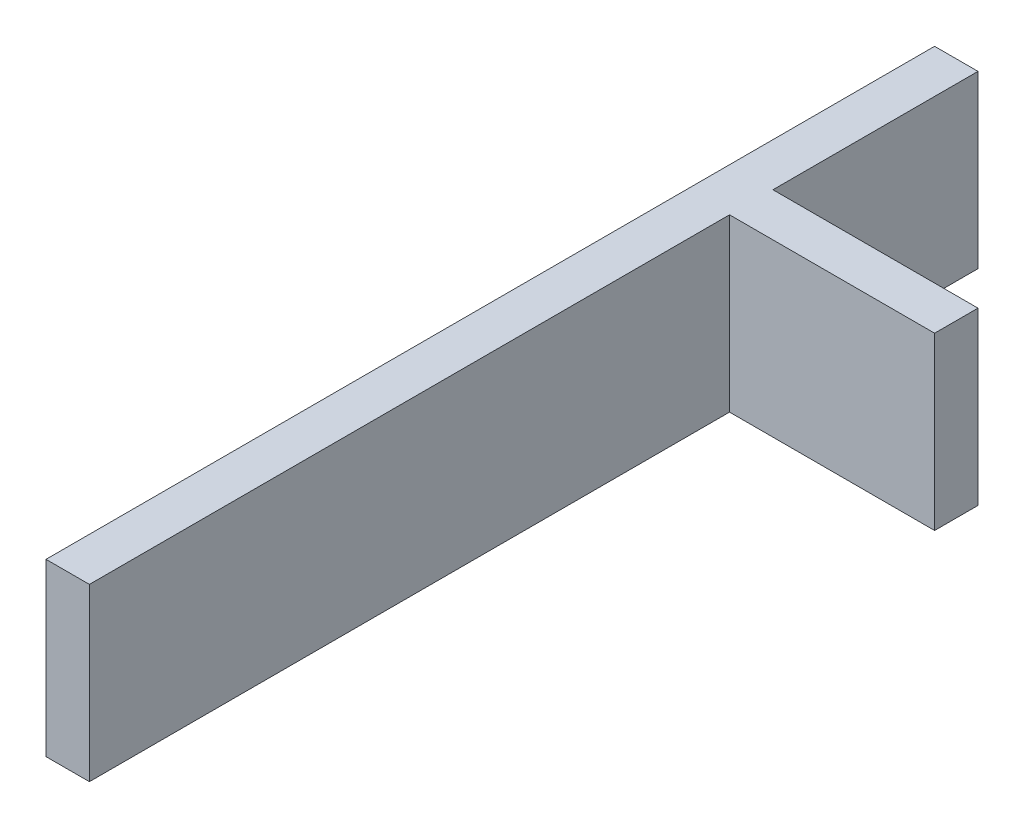
ISO-10303-21;
HEADER;
FILE_DESCRIPTION(('STEP AP214'),'2;1');
FILE_NAME('part.step','',(''),(''),'','','');
FILE_SCHEMA(('AUTOMOTIVE_DESIGN { 1 0 10303 214 1 1 1 1 }'));
ENDSEC;
DATA;
#1=APPLICATION_CONTEXT('core data for automotive mechanical design processes');
#2=APPLICATION_PROTOCOL_DEFINITION('international standard','automotive_design',2000,#1);
#3=PRODUCT_CONTEXT('',#1,'mechanical');
#4=PRODUCT('Part','Part','',(#3));
#5=PRODUCT_RELATED_PRODUCT_CATEGORY('part','',(#4));
#6=PRODUCT_DEFINITION_FORMATION('','',#4);
#7=PRODUCT_DEFINITION_CONTEXT('part definition',#1,'design');
#8=PRODUCT_DEFINITION('design','',#6,#7);
#9=PRODUCT_DEFINITION_SHAPE('','',#8);
#10=(LENGTH_UNIT() NAMED_UNIT(*) SI_UNIT(.MILLI.,.METRE.));
#11=(NAMED_UNIT(*) PLANE_ANGLE_UNIT() SI_UNIT($,.RADIAN.));
#12=(NAMED_UNIT(*) SI_UNIT($,.STERADIAN.) SOLID_ANGLE_UNIT());
#13=UNCERTAINTY_MEASURE_WITH_UNIT(LENGTH_MEASURE(1.E-05),#10,'distance_accuracy_value','');
#14=(GEOMETRIC_REPRESENTATION_CONTEXT(3) GLOBAL_UNCERTAINTY_ASSIGNED_CONTEXT((#13)) GLOBAL_UNIT_ASSIGNED_CONTEXT((#10,
#11,#12)) REPRESENTATION_CONTEXT('',''));
#15=CARTESIAN_POINT('',(0.,0.,0.));
#16=DIRECTION('',(0.,0.,1.));
#17=DIRECTION('',(1.,0.,0.));
#18=AXIS2_PLACEMENT_3D('',#15,#16,#17);
#19=CARTESIAN_POINT('',(3.175,-12.5,130.));
#20=DIRECTION('',(-1.,0.,0.));
#21=DIRECTION('',(0.,0.,1.));
#22=AXIS2_PLACEMENT_3D('',#19,#20,#21);
#23=PLANE('',#22);
#24=DIRECTION('',(0.,1.,0.));
#25=VECTOR('',#24,1.);
#26=CARTESIAN_POINT('',(3.175,12.5,30.));
#27=LINE('',#26,#25);
#28=CARTESIAN_POINT('',(3.175,-12.5,30.));
#29=VERTEX_POINT('',#28);
#30=CARTESIAN_POINT('',(3.175,12.5,30.));
#31=VERTEX_POINT('',#30);
#32=EDGE_CURVE('E53',#29,#31,#27,.T.);
#33=ORIENTED_EDGE('',*,*,#32,.F.);
#34=DIRECTION('',(0.,0.,-1.));
#35=VECTOR('',#34,1.);
#36=CARTESIAN_POINT('',(3.175,-12.5,130.));
#37=LINE('',#36,#35);
#38=CARTESIAN_POINT('',(3.175,-12.5,0.));
#39=VERTEX_POINT('',#38);
#40=EDGE_CURVE('E154',#29,#39,#37,.T.);
#41=ORIENTED_EDGE('',*,*,#40,.T.);
#42=DIRECTION('',(0.,1.,0.));
#43=VECTOR('',#42,1.);
#44=CARTESIAN_POINT('',(3.175,-12.5,0.));
#45=LINE('',#44,#43);
#46=CARTESIAN_POINT('',(3.175,12.5,0.));
#47=VERTEX_POINT('',#46);
#48=EDGE_CURVE('E149',#39,#47,#45,.T.);
#49=ORIENTED_EDGE('',*,*,#48,.T.);
#50=DIRECTION('',(0.,0.,-1.));
#51=VECTOR('',#50,1.);
#52=CARTESIAN_POINT('',(3.175,12.5,130.));
#53=LINE('',#52,#51);
#54=EDGE_CURVE('E58',#31,#47,#53,.T.);
#55=ORIENTED_EDGE('',*,*,#54,.F.);
#56=EDGE_LOOP('',(#33,#41,#49,#55));
#57=FACE_BOUND('',#56,.T.);
#58=ADVANCED_FACE('F38',(#57),#23,.F.);
#59=DIRECTION('',(0.,-1.,0.));
#60=VECTOR('',#59,1.);
#61=CARTESIAN_POINT('',(3.175,-12.5,36.35));
#62=LINE('',#61,#60);
#63=CARTESIAN_POINT('',(3.175,12.5,36.35));
#64=VERTEX_POINT('',#63);
#65=CARTESIAN_POINT('',(3.175,-12.5,36.35));
#66=VERTEX_POINT('',#65);
#67=EDGE_CURVE('E174',#64,#66,#62,.T.);
#68=ORIENTED_EDGE('',*,*,#67,.F.);
#69=CARTESIAN_POINT('',(3.175,12.5,130.));
#70=VERTEX_POINT('',#69);
#71=EDGE_CURVE('E126',#70,#64,#53,.T.);
#72=ORIENTED_EDGE('',*,*,#71,.F.);
#73=DIRECTION('',(0.,1.,0.));
#74=VECTOR('',#73,1.);
#75=CARTESIAN_POINT('',(3.175,-12.5,130.));
#76=LINE('',#75,#74);
#77=CARTESIAN_POINT('',(3.175,-12.5,130.));
#78=VERTEX_POINT('',#77);
#79=EDGE_CURVE('E142',#78,#70,#76,.T.);
#80=ORIENTED_EDGE('',*,*,#79,.F.);
#81=EDGE_CURVE('E46',#78,#66,#37,.T.);
#82=ORIENTED_EDGE('',*,*,#81,.T.);
#83=EDGE_LOOP('',(#68,#72,#80,#82));
#84=FACE_BOUND('',#83,.T.);
#85=ADVANCED_FACE('F173',(#84),#23,.F.);
#86=CARTESIAN_POINT('',(-3.175,-12.5,130.));
#87=DIRECTION('',(1.,0.,0.));
#88=DIRECTION('',(0.,0.,-1.));
#89=AXIS2_PLACEMENT_3D('',#86,#87,#88);
#90=PLANE('',#89);
#91=DIRECTION('',(0.,-1.,0.));
#92=VECTOR('',#91,1.);
#93=CARTESIAN_POINT('',(-3.175,-12.5,0.));
#94=LINE('',#93,#92);
#95=CARTESIAN_POINT('',(-3.175,12.5,0.));
#96=VERTEX_POINT('',#95);
#97=CARTESIAN_POINT('',(-3.175,-12.5,0.));
#98=VERTEX_POINT('',#97);
#99=EDGE_CURVE('E127',#96,#98,#94,.T.);
#100=ORIENTED_EDGE('',*,*,#99,.T.);
#101=DIRECTION('',(0.,0.,-1.));
#102=VECTOR('',#101,1.);
#103=CARTESIAN_POINT('',(-3.175,-12.5,130.));
#104=LINE('',#103,#102);
#105=CARTESIAN_POINT('',(-3.175,-12.5,130.));
#106=VERTEX_POINT('',#105);
#107=EDGE_CURVE('E11',#106,#98,#104,.T.);
#108=ORIENTED_EDGE('',*,*,#107,.F.);
#109=DIRECTION('',(0.,-1.,0.));
#110=VECTOR('',#109,1.);
#111=CARTESIAN_POINT('',(-3.175,-12.5,130.));
#112=LINE('',#111,#110);
#113=CARTESIAN_POINT('',(-3.175,12.5,130.));
#114=VERTEX_POINT('',#113);
#115=EDGE_CURVE('E136',#114,#106,#112,.T.);
#116=ORIENTED_EDGE('',*,*,#115,.F.);
#117=DIRECTION('',(0.,0.,-1.));
#118=VECTOR('',#117,1.);
#119=CARTESIAN_POINT('',(-3.175,12.5,130.));
#120=LINE('',#119,#118);
#121=EDGE_CURVE('E145',#114,#96,#120,.T.);
#122=ORIENTED_EDGE('',*,*,#121,.T.);
#123=EDGE_LOOP('',(#100,#108,#116,#122));
#124=FACE_BOUND('',#123,.T.);
#125=ADVANCED_FACE('F40',(#124),#90,.F.);
#126=CARTESIAN_POINT('',(3.175,-12.5,130.));
#127=DIRECTION('',(0.,1.,0.));
#128=DIRECTION('',(0.,0.,1.));
#129=AXIS2_PLACEMENT_3D('',#126,#127,#128);
#130=PLANE('',#129);
#131=DIRECTION('',(1.,0.,0.));
#132=VECTOR('',#131,1.);
#133=CARTESIAN_POINT('',(3.175,-12.5,0.));
#134=LINE('',#133,#132);
#135=EDGE_CURVE('E130',#98,#39,#134,.T.);
#136=ORIENTED_EDGE('',*,*,#135,.T.);
#137=ORIENTED_EDGE('',*,*,#40,.F.);
#138=DIRECTION('',(-1.,0.,0.));
#139=VECTOR('',#138,1.);
#140=CARTESIAN_POINT('',(33.175,-12.5,30.));
#141=LINE('',#140,#139);
#142=CARTESIAN_POINT('',(33.175,-12.5,30.));
#143=VERTEX_POINT('',#142);
#144=EDGE_CURVE('E132',#143,#29,#141,.T.);
#145=ORIENTED_EDGE('',*,*,#144,.F.);
#146=DIRECTION('',(0.,0.,-1.));
#147=VECTOR('',#146,1.);
#148=CARTESIAN_POINT('',(33.175,-12.5,30.));
#149=LINE('',#148,#147);
#150=CARTESIAN_POINT('',(33.175,-12.5,36.35));
#151=VERTEX_POINT('',#150);
#152=EDGE_CURVE('E111',#151,#143,#149,.T.);
#153=ORIENTED_EDGE('',*,*,#152,.F.);
#154=DIRECTION('',(-1.,0.,0.));
#155=VECTOR('',#154,1.);
#156=CARTESIAN_POINT('',(33.175,-12.5,36.35));
#157=LINE('',#156,#155);
#158=EDGE_CURVE('E108',#151,#66,#157,.T.);
#159=ORIENTED_EDGE('',*,*,#158,.T.);
#160=ORIENTED_EDGE('',*,*,#81,.F.);
#161=DIRECTION('',(1.,0.,0.));
#162=VECTOR('',#161,1.);
#163=CARTESIAN_POINT('',(3.175,-12.5,130.));
#164=LINE('',#163,#162);
#165=EDGE_CURVE('E139',#106,#78,#164,.T.);
#166=ORIENTED_EDGE('',*,*,#165,.F.);
#167=ORIENTED_EDGE('',*,*,#107,.T.);
#168=EDGE_LOOP('',(#136,#137,#145,#153,#159,#160,#166,#167));
#169=FACE_BOUND('',#168,.T.);
#170=ADVANCED_FACE('F163',(#169),#130,.F.);
#171=CARTESIAN_POINT('',(3.175,12.5,130.));
#172=DIRECTION('',(0.,-1.,0.));
#173=DIRECTION('',(0.,0.,-1.));
#174=AXIS2_PLACEMENT_3D('',#171,#172,#173);
#175=PLANE('',#174);
#176=DIRECTION('',(-1.,0.,0.));
#177=VECTOR('',#176,1.);
#178=CARTESIAN_POINT('',(3.175,12.5,0.));
#179=LINE('',#178,#177);
#180=EDGE_CURVE('E140',#47,#96,#179,.T.);
#181=ORIENTED_EDGE('',*,*,#180,.T.);
#182=ORIENTED_EDGE('',*,*,#121,.F.);
#183=DIRECTION('',(-1.,0.,0.));
#184=VECTOR('',#183,1.);
#185=CARTESIAN_POINT('',(3.175,12.5,130.));
#186=LINE('',#185,#184);
#187=EDGE_CURVE('E144',#70,#114,#186,.T.);
#188=ORIENTED_EDGE('',*,*,#187,.F.);
#189=ORIENTED_EDGE('',*,*,#71,.T.);
#190=DIRECTION('',(-1.,0.,0.));
#191=VECTOR('',#190,1.);
#192=CARTESIAN_POINT('',(33.175,12.5,36.35));
#193=LINE('',#192,#191);
#194=CARTESIAN_POINT('',(33.175,12.5,36.35));
#195=VERTEX_POINT('',#194);
#196=EDGE_CURVE('E106',#195,#64,#193,.T.);
#197=ORIENTED_EDGE('',*,*,#196,.F.);
#198=DIRECTION('',(0.,0.,1.));
#199=VECTOR('',#198,1.);
#200=CARTESIAN_POINT('',(33.175,12.5,36.35));
#201=LINE('',#200,#199);
#202=CARTESIAN_POINT('',(33.175,12.5,30.));
#203=VERTEX_POINT('',#202);
#204=EDGE_CURVE('E112',#203,#195,#201,.T.);
#205=ORIENTED_EDGE('',*,*,#204,.F.);
#206=DIRECTION('',(-1.,0.,0.));
#207=VECTOR('',#206,1.);
#208=CARTESIAN_POINT('',(33.175,12.5,30.));
#209=LINE('',#208,#207);
#210=EDGE_CURVE('E180',#203,#31,#209,.T.);
#211=ORIENTED_EDGE('',*,*,#210,.T.);
#212=ORIENTED_EDGE('',*,*,#54,.T.);
#213=EDGE_LOOP('',(#181,#182,#188,#189,#197,#205,#211,#212));
#214=FACE_BOUND('',#213,.T.);
#215=ADVANCED_FACE('F123',(#214),#175,.F.);
#216=CARTESIAN_POINT('',(0.,0.,130.));
#217=DIRECTION('',(0.,0.,1.));
#218=DIRECTION('',(1.,0.,0.));
#219=AXIS2_PLACEMENT_3D('',#216,#217,#218);
#220=PLANE('',#219);
#221=ORIENTED_EDGE('',*,*,#115,.T.);
#222=ORIENTED_EDGE('',*,*,#165,.T.);
#223=ORIENTED_EDGE('',*,*,#79,.T.);
#224=ORIENTED_EDGE('',*,*,#187,.T.);
#225=EDGE_LOOP('',(#221,#222,#223,#224));
#226=FACE_BOUND('',#225,.T.);
#227=ADVANCED_FACE('F172',(#226),#220,.T.);
#228=CARTESIAN_POINT('',(0.,0.,0.));
#229=DIRECTION('',(0.,0.,1.));
#230=DIRECTION('',(1.,0.,0.));
#231=AXIS2_PLACEMENT_3D('',#228,#229,#230);
#232=PLANE('',#231);
#233=ORIENTED_EDGE('',*,*,#99,.F.);
#234=ORIENTED_EDGE('',*,*,#180,.F.);
#235=ORIENTED_EDGE('',*,*,#48,.F.);
#236=ORIENTED_EDGE('',*,*,#135,.F.);
#237=EDGE_LOOP('',(#233,#234,#235,#236));
#238=FACE_BOUND('',#237,.T.);
#239=ADVANCED_FACE('F167',(#238),#232,.F.);
#240=CARTESIAN_POINT('',(33.175,-12.5,36.35));
#241=DIRECTION('',(0.,0.,-1.));
#242=DIRECTION('',(-1.,0.,0.));
#243=AXIS2_PLACEMENT_3D('',#240,#241,#242);
#244=PLANE('',#243);
#245=ORIENTED_EDGE('',*,*,#67,.T.);
#246=ORIENTED_EDGE('',*,*,#158,.F.);
#247=DIRECTION('',(0.,-1.,0.));
#248=VECTOR('',#247,1.);
#249=CARTESIAN_POINT('',(33.175,-12.5,36.35));
#250=LINE('',#249,#248);
#251=EDGE_CURVE('E101',#195,#151,#250,.T.);
#252=ORIENTED_EDGE('',*,*,#251,.F.);
#253=ORIENTED_EDGE('',*,*,#196,.T.);
#254=EDGE_LOOP('',(#245,#246,#252,#253));
#255=FACE_BOUND('',#254,.T.);
#256=ADVANCED_FACE('F104',(#255),#244,.F.);
#257=CARTESIAN_POINT('',(33.175,12.5,30.));
#258=DIRECTION('',(0.,0.,1.));
#259=DIRECTION('',(1.,0.,0.));
#260=AXIS2_PLACEMENT_3D('',#257,#258,#259);
#261=PLANE('',#260);
#262=ORIENTED_EDGE('',*,*,#32,.T.);
#263=ORIENTED_EDGE('',*,*,#210,.F.);
#264=DIRECTION('',(0.,1.,0.));
#265=VECTOR('',#264,1.);
#266=CARTESIAN_POINT('',(33.175,12.5,30.));
#267=LINE('',#266,#265);
#268=EDGE_CURVE('E117',#143,#203,#267,.T.);
#269=ORIENTED_EDGE('',*,*,#268,.F.);
#270=ORIENTED_EDGE('',*,*,#144,.T.);
#271=EDGE_LOOP('',(#262,#263,#269,#270));
#272=FACE_BOUND('',#271,.T.);
#273=ADVANCED_FACE('F182',(#272),#261,.F.);
#274=CARTESIAN_POINT('',(33.175,0.,0.));
#275=DIRECTION('',(-1.,0.,0.));
#276=DIRECTION('',(0.,0.,1.));
#277=AXIS2_PLACEMENT_3D('',#274,#275,#276);
#278=PLANE('',#277);
#279=ORIENTED_EDGE('',*,*,#204,.T.);
#280=ORIENTED_EDGE('',*,*,#251,.T.);
#281=ORIENTED_EDGE('',*,*,#152,.T.);
#282=ORIENTED_EDGE('',*,*,#268,.T.);
#283=EDGE_LOOP('',(#279,#280,#281,#282));
#284=FACE_BOUND('',#283,.T.);
#285=ADVANCED_FACE('F115',(#284),#278,.F.);
#286=CLOSED_SHELL('',(#58,#85,#125,#170,#215,#227,#239,#256,#273,#285));
#287=MANIFOLD_SOLID_BREP('B2',#286);
#288=ADVANCED_BREP_SHAPE_REPRESENTATION('',(#18,#287),#14);
#289=SHAPE_DEFINITION_REPRESENTATION(#9,#288);
ENDSEC;
END-ISO-10303-21;
